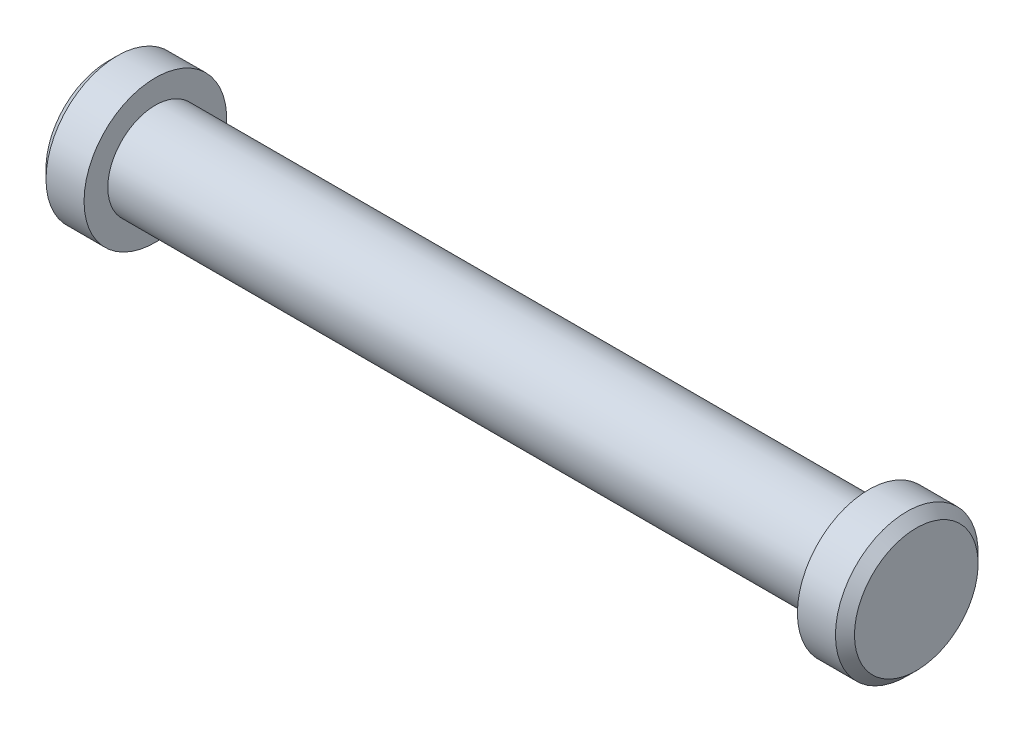
ISO-10303-21;
HEADER;
FILE_DESCRIPTION(('STEP AP214'),'2;1');
FILE_NAME('part.step','',(''),(''),'','','');
FILE_SCHEMA(('AUTOMOTIVE_DESIGN { 1 0 10303 214 1 1 1 1 }'));
ENDSEC;
DATA;
#1=APPLICATION_CONTEXT('core data for automotive mechanical design processes');
#2=APPLICATION_PROTOCOL_DEFINITION('international standard','automotive_design',2000,#1);
#3=PRODUCT_CONTEXT('',#1,'mechanical');
#4=PRODUCT('Part','Part','',(#3));
#5=PRODUCT_RELATED_PRODUCT_CATEGORY('part','',(#4));
#6=PRODUCT_DEFINITION_FORMATION('','',#4);
#7=PRODUCT_DEFINITION_CONTEXT('part definition',#1,'design');
#8=PRODUCT_DEFINITION('design','',#6,#7);
#9=PRODUCT_DEFINITION_SHAPE('','',#8);
#10=(LENGTH_UNIT() NAMED_UNIT(*) SI_UNIT(.MILLI.,.METRE.));
#11=(NAMED_UNIT(*) PLANE_ANGLE_UNIT() SI_UNIT($,.RADIAN.));
#12=(NAMED_UNIT(*) SI_UNIT($,.STERADIAN.) SOLID_ANGLE_UNIT());
#13=UNCERTAINTY_MEASURE_WITH_UNIT(LENGTH_MEASURE(1.E-05),#10,'distance_accuracy_value','');
#14=(GEOMETRIC_REPRESENTATION_CONTEXT(3) GLOBAL_UNCERTAINTY_ASSIGNED_CONTEXT((#13)) GLOBAL_UNIT_ASSIGNED_CONTEXT((#10,
#11,#12)) REPRESENTATION_CONTEXT('',''));
#15=CARTESIAN_POINT('',(0.,0.,0.));
#16=DIRECTION('',(0.,0.,1.));
#17=DIRECTION('',(1.,0.,0.));
#18=AXIS2_PLACEMENT_3D('',#15,#16,#17);
#19=CARTESIAN_POINT('',(-16.1925,0.,0.));
#20=DIRECTION('',(1.,0.,0.));
#21=DIRECTION('',(0.,0.,-1.));
#22=AXIS2_PLACEMENT_3D('',#19,#20,#21);
#23=PLANE('',#22);
#24=CARTESIAN_POINT('',(-16.1925,0.,0.));
#25=DIRECTION('',(1.,0.,0.));
#26=DIRECTION('',(0.,0.,-1.));
#27=AXIS2_PLACEMENT_3D('',#24,#25,#26);
#28=CIRCLE('',#27,2.4765);
#29=CARTESIAN_POINT('',(-16.1925,0.,-2.4765));
#30=VERTEX_POINT('',#29);
#31=EDGE_CURVE('E52',#30,#30,#28,.F.);
#32=ORIENTED_EDGE('',*,*,#31,.T.);
#33=EDGE_LOOP('',(#32));
#34=FACE_BOUND('',#33,.T.);
#35=ADVANCED_FACE('F37',(#34),#23,.F.);
#36=CARTESIAN_POINT('',(-16.1925,0.,0.));
#37=DIRECTION('',(-1.,0.,0.));
#38=DIRECTION('',(0.,0.,1.));
#39=AXIS2_PLACEMENT_3D('',#36,#37,#38);
#40=CYLINDRICAL_SURFACE('',#39,2.8575);
#41=CARTESIAN_POINT('',(-15.8115,0.,0.));
#42=DIRECTION('',(1.,0.,0.));
#43=DIRECTION('',(0.,0.,-1.));
#44=AXIS2_PLACEMENT_3D('',#41,#42,#43);
#45=CIRCLE('',#44,2.8575);
#46=CARTESIAN_POINT('',(-15.8115,0.,-2.8575));
#47=VERTEX_POINT('',#46);
#48=EDGE_CURVE('E48',#47,#47,#45,.T.);
#49=ORIENTED_EDGE('',*,*,#48,.T.);
#50=EDGE_LOOP('',(#49));
#51=FACE_BOUND('',#50,.T.);
#52=CARTESIAN_POINT('',(-14.2875,0.,0.));
#53=DIRECTION('',(-1.,0.,0.));
#54=DIRECTION('',(0.,0.,1.));
#55=AXIS2_PLACEMENT_3D('',#52,#53,#54);
#56=CIRCLE('',#55,2.8575);
#57=CARTESIAN_POINT('',(-14.2875,0.,2.8575));
#58=VERTEX_POINT('',#57);
#59=EDGE_CURVE('E57',#58,#58,#56,.T.);
#60=ORIENTED_EDGE('',*,*,#59,.T.);
#61=EDGE_LOOP('',(#60));
#62=FACE_BOUND('',#61,.T.);
#63=ADVANCED_FACE('F86',(#51,#62),#40,.T.);
#64=CARTESIAN_POINT('',(-14.2875,2.8575,0.));
#65=DIRECTION('',(-1.,0.,0.));
#66=DIRECTION('',(0.,0.,1.));
#67=AXIS2_PLACEMENT_3D('',#64,#65,#66);
#68=PLANE('',#67);
#69=ORIENTED_EDGE('',*,*,#59,.F.);
#70=EDGE_LOOP('',(#69));
#71=FACE_BOUND('',#70,.T.);
#72=CARTESIAN_POINT('',(-14.2875,0.,0.));
#73=DIRECTION('',(-1.,0.,0.));
#74=DIRECTION('',(0.,0.,1.));
#75=AXIS2_PLACEMENT_3D('',#72,#73,#74);
#76=CIRCLE('',#75,1.905);
#77=CARTESIAN_POINT('',(-14.2875,0.,1.905));
#78=VERTEX_POINT('',#77);
#79=EDGE_CURVE('E60',#78,#78,#76,.T.);
#80=ORIENTED_EDGE('',*,*,#79,.T.);
#81=EDGE_LOOP('',(#80));
#82=FACE_BOUND('',#81,.T.);
#83=ADVANCED_FACE('F92',(#71,#82),#68,.F.);
#84=CARTESIAN_POINT('',(-16.1925,0.,0.));
#85=DIRECTION('',(-1.,0.,0.));
#86=DIRECTION('',(0.,0.,1.));
#87=AXIS2_PLACEMENT_3D('',#84,#85,#86);
#88=CYLINDRICAL_SURFACE('',#87,1.905);
#89=ORIENTED_EDGE('',*,*,#79,.F.);
#90=EDGE_LOOP('',(#89));
#91=FACE_BOUND('',#90,.T.);
#92=CARTESIAN_POINT('',(14.2875,0.,0.));
#93=DIRECTION('',(-1.,0.,0.));
#94=DIRECTION('',(0.,0.,1.));
#95=AXIS2_PLACEMENT_3D('',#92,#93,#94);
#96=CIRCLE('',#95,1.905);
#97=CARTESIAN_POINT('',(14.2875,0.,1.905));
#98=VERTEX_POINT('',#97);
#99=EDGE_CURVE('E63',#98,#98,#96,.T.);
#100=ORIENTED_EDGE('',*,*,#99,.T.);
#101=EDGE_LOOP('',(#100));
#102=FACE_BOUND('',#101,.T.);
#103=ADVANCED_FACE('F82',(#91,#102),#88,.T.);
#104=CARTESIAN_POINT('',(14.2875,1.905,0.));
#105=DIRECTION('',(1.,0.,0.));
#106=DIRECTION('',(0.,0.,-1.));
#107=AXIS2_PLACEMENT_3D('',#104,#105,#106);
#108=PLANE('',#107);
#109=ORIENTED_EDGE('',*,*,#99,.F.);
#110=EDGE_LOOP('',(#109));
#111=FACE_BOUND('',#110,.T.);
#112=CARTESIAN_POINT('',(14.2875,0.,0.));
#113=DIRECTION('',(-1.,0.,0.));
#114=DIRECTION('',(0.,0.,1.));
#115=AXIS2_PLACEMENT_3D('',#112,#113,#114);
#116=CIRCLE('',#115,2.8575);
#117=CARTESIAN_POINT('',(14.2875,0.,2.8575));
#118=VERTEX_POINT('',#117);
#119=EDGE_CURVE('E66',#118,#118,#116,.T.);
#120=ORIENTED_EDGE('',*,*,#119,.T.);
#121=EDGE_LOOP('',(#120));
#122=FACE_BOUND('',#121,.T.);
#123=ADVANCED_FACE('F70',(#111,#122),#108,.F.);
#124=CARTESIAN_POINT('',(-16.1925,0.,0.));
#125=DIRECTION('',(-1.,0.,0.));
#126=DIRECTION('',(0.,0.,1.));
#127=AXIS2_PLACEMENT_3D('',#124,#125,#126);
#128=CYLINDRICAL_SURFACE('',#127,2.8575);
#129=CARTESIAN_POINT('',(15.8115,0.,0.));
#130=DIRECTION('',(-1.,0.,0.));
#131=DIRECTION('',(0.,0.,1.));
#132=AXIS2_PLACEMENT_3D('',#129,#130,#131);
#133=CIRCLE('',#132,2.8575);
#134=CARTESIAN_POINT('',(15.8115,0.,2.8575));
#135=VERTEX_POINT('',#134);
#136=EDGE_CURVE('E44',#135,#135,#133,.T.);
#137=ORIENTED_EDGE('',*,*,#136,.T.);
#138=EDGE_LOOP('',(#137));
#139=FACE_BOUND('',#138,.T.);
#140=ORIENTED_EDGE('',*,*,#119,.F.);
#141=EDGE_LOOP('',(#140));
#142=FACE_BOUND('',#141,.T.);
#143=ADVANCED_FACE('F72',(#139,#142),#128,.T.);
#144=CARTESIAN_POINT('',(16.1925,2.8575,0.));
#145=DIRECTION('',(-1.,0.,0.));
#146=DIRECTION('',(0.,0.,1.));
#147=AXIS2_PLACEMENT_3D('',#144,#145,#146);
#148=PLANE('',#147);
#149=CARTESIAN_POINT('',(16.1925,0.,0.));
#150=DIRECTION('',(-1.,0.,0.));
#151=DIRECTION('',(0.,0.,1.));
#152=AXIS2_PLACEMENT_3D('',#149,#150,#151);
#153=CIRCLE('',#152,2.4765);
#154=CARTESIAN_POINT('',(16.1925,0.,2.4765));
#155=VERTEX_POINT('',#154);
#156=EDGE_CURVE('E10',#155,#155,#153,.F.);
#157=ORIENTED_EDGE('',*,*,#156,.T.);
#158=EDGE_LOOP('',(#157));
#159=FACE_BOUND('',#158,.T.);
#160=ADVANCED_FACE('F74',(#159),#148,.F.);
#161=CARTESIAN_POINT('',(-16.1925,0.,0.));
#162=DIRECTION('',(1.,0.,0.));
#163=DIRECTION('',(0.,0.,-1.));
#164=AXIS2_PLACEMENT_3D('',#161,#162,#163);
#165=CONICAL_SURFACE('',#164,2.4765,0.78539816339744);
#166=ORIENTED_EDGE('',*,*,#48,.F.);
#167=EDGE_LOOP('',(#166));
#168=FACE_BOUND('',#167,.T.);
#169=ORIENTED_EDGE('',*,*,#31,.F.);
#170=EDGE_LOOP('',(#169));
#171=FACE_BOUND('',#170,.T.);
#172=ADVANCED_FACE('F80',(#168,#171),#165,.T.);
#173=CARTESIAN_POINT('',(15.8115,0.,0.));
#174=DIRECTION('',(-1.,0.,0.));
#175=DIRECTION('',(0.,0.,1.));
#176=AXIS2_PLACEMENT_3D('',#173,#174,#175);
#177=CONICAL_SURFACE('',#176,2.8575,0.785398163397457);
#178=ORIENTED_EDGE('',*,*,#156,.F.);
#179=EDGE_LOOP('',(#178));
#180=FACE_BOUND('',#179,.T.);
#181=ORIENTED_EDGE('',*,*,#136,.F.);
#182=EDGE_LOOP('',(#181));
#183=FACE_BOUND('',#182,.T.);
#184=ADVANCED_FACE('F39',(#180,#183),#177,.T.);
#185=CLOSED_SHELL('',(#35,#63,#83,#103,#123,#143,#160,#172,#184));
#186=MANIFOLD_SOLID_BREP('B2',#185);
#187=ADVANCED_BREP_SHAPE_REPRESENTATION('',(#18,#186),#14);
#188=SHAPE_DEFINITION_REPRESENTATION(#9,#187);
ENDSEC;
END-ISO-10303-21;
